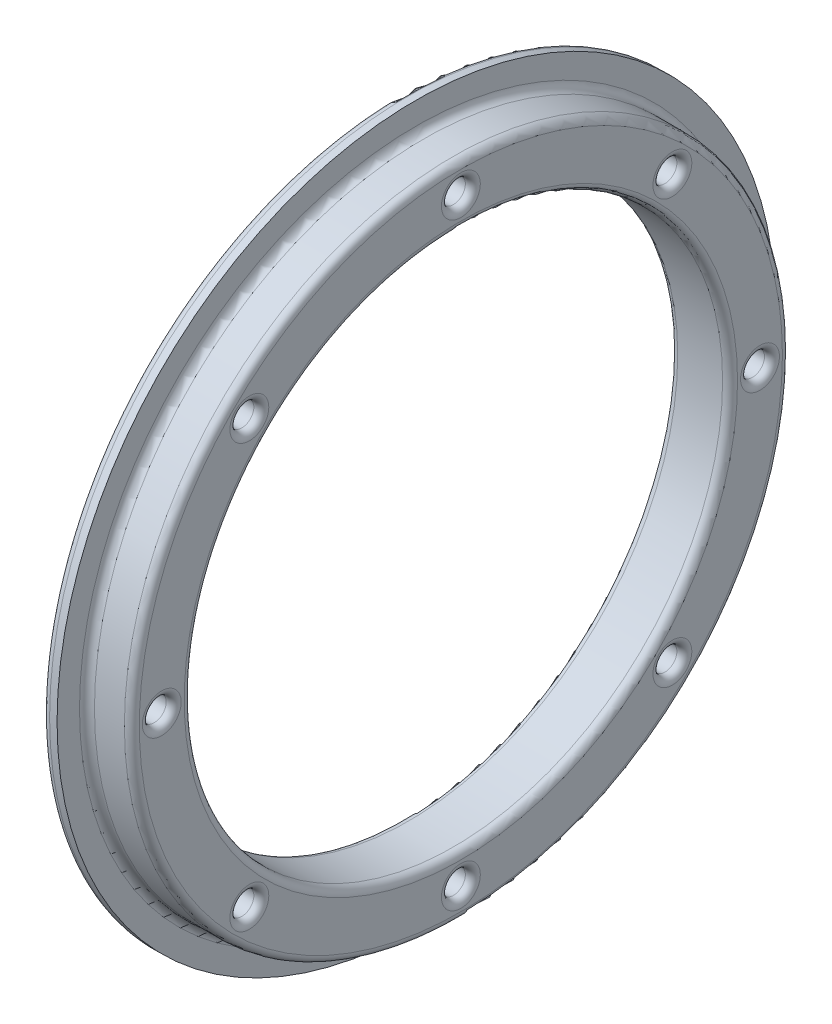
ISO-10303-21;
HEADER;
FILE_DESCRIPTION(('STEP AP214'),'2;1');
FILE_NAME('part.step','',(''),(''),'','','');
FILE_SCHEMA(('AUTOMOTIVE_DESIGN { 1 0 10303 214 1 1 1 1 }'));
ENDSEC;
DATA;
#1=APPLICATION_CONTEXT('core data for automotive mechanical design processes');
#2=APPLICATION_PROTOCOL_DEFINITION('international standard','automotive_design',2000,#1);
#3=PRODUCT_CONTEXT('',#1,'mechanical');
#4=PRODUCT('Part','Part','',(#3));
#5=PRODUCT_RELATED_PRODUCT_CATEGORY('part','',(#4));
#6=PRODUCT_DEFINITION_FORMATION('','',#4);
#7=PRODUCT_DEFINITION_CONTEXT('part definition',#1,'design');
#8=PRODUCT_DEFINITION('design','',#6,#7);
#9=PRODUCT_DEFINITION_SHAPE('','',#8);
#10=(LENGTH_UNIT() NAMED_UNIT(*) SI_UNIT(.MILLI.,.METRE.));
#11=(NAMED_UNIT(*) PLANE_ANGLE_UNIT() SI_UNIT($,.RADIAN.));
#12=(NAMED_UNIT(*) SI_UNIT($,.STERADIAN.) SOLID_ANGLE_UNIT());
#13=UNCERTAINTY_MEASURE_WITH_UNIT(LENGTH_MEASURE(1.E-05),#10,'distance_accuracy_value','');
#14=(GEOMETRIC_REPRESENTATION_CONTEXT(3) GLOBAL_UNCERTAINTY_ASSIGNED_CONTEXT((#13)) GLOBAL_UNIT_ASSIGNED_CONTEXT((#10,
#11,#12)) REPRESENTATION_CONTEXT('',''));
#15=CARTESIAN_POINT('',(0.,0.,0.));
#16=DIRECTION('',(0.,0.,1.));
#17=DIRECTION('',(1.,0.,0.));
#18=AXIS2_PLACEMENT_3D('',#15,#16,#17);
#19=CARTESIAN_POINT('',(3.175,0.,0.));
#20=DIRECTION('',(-1.,0.,0.));
#21=DIRECTION('',(0.,0.,1.));
#22=AXIS2_PLACEMENT_3D('',#19,#20,#21);
#23=CYLINDRICAL_SURFACE('',#22,34.925);
#24=CARTESIAN_POINT('',(2.38125,0.,0.));
#25=DIRECTION('',(1.,0.,0.));
#26=DIRECTION('',(0.,0.,-1.));
#27=AXIS2_PLACEMENT_3D('',#24,#25,#26);
#28=CIRCLE('',#27,34.925);
#29=CARTESIAN_POINT('',(2.38125,0.,-34.925));
#30=VERTEX_POINT('',#29);
#31=EDGE_CURVE('E38',#30,#30,#28,.F.);
#32=ORIENTED_EDGE('',*,*,#31,.T.);
#33=EDGE_LOOP('',(#32));
#34=FACE_BOUND('',#33,.T.);
#35=CARTESIAN_POINT('',(-0.79375,0.,0.));
#36=DIRECTION('',(-1.,0.,0.));
#37=DIRECTION('',(0.,0.,1.));
#38=AXIS2_PLACEMENT_3D('',#35,#36,#37);
#39=CIRCLE('',#38,34.925);
#40=CARTESIAN_POINT('',(-0.79375,0.,34.925));
#41=VERTEX_POINT('',#40);
#42=EDGE_CURVE('E42',#41,#41,#39,.F.);
#43=ORIENTED_EDGE('',*,*,#42,.T.);
#44=EDGE_LOOP('',(#43));
#45=FACE_BOUND('',#44,.T.);
#46=ADVANCED_FACE('F31',(#34,#45),#23,.T.);
#47=CARTESIAN_POINT('',(3.175,0.,0.));
#48=DIRECTION('',(1.,0.,0.));
#49=DIRECTION('',(0.,0.,-1.));
#50=AXIS2_PLACEMENT_3D('',#47,#48,#49);
#51=PLANE('',#50);
#52=CARTESIAN_POINT('',(3.175,-22.4506403026729,22.4506403026729));
#53=DIRECTION('',(1.,0.,0.));
#54=DIRECTION('',(0.,0.,-1.));
#55=AXIS2_PLACEMENT_3D('',#52,#53,#54);
#56=CIRCLE('',#55,2.06375);
#57=CARTESIAN_POINT('',(3.175,-22.4506403026729,20.3868903026729));
#58=VERTEX_POINT('',#57);
#59=EDGE_CURVE('E46',#58,#58,#56,.F.);
#60=ORIENTED_EDGE('',*,*,#59,.T.);
#61=EDGE_LOOP('',(#60));
#62=FACE_BOUND('',#61,.T.);
#63=CARTESIAN_POINT('',(3.175,-22.4506403026729,-22.4506403026729));
#64=DIRECTION('',(1.,0.,0.));
#65=DIRECTION('',(0.,0.,-1.));
#66=AXIS2_PLACEMENT_3D('',#63,#64,#65);
#67=CIRCLE('',#66,2.06375);
#68=CARTESIAN_POINT('',(3.175,-22.4506403026729,-24.5143903026729));
#69=VERTEX_POINT('',#68);
#70=EDGE_CURVE('E51',#69,#69,#67,.F.);
#71=ORIENTED_EDGE('',*,*,#70,.T.);
#72=EDGE_LOOP('',(#71));
#73=FACE_BOUND('',#72,.T.);
#74=CARTESIAN_POINT('',(3.175,22.4506403026729,-22.4506403026729));
#75=DIRECTION('',(1.,0.,0.));
#76=DIRECTION('',(0.,0.,-1.));
#77=AXIS2_PLACEMENT_3D('',#74,#75,#76);
#78=CIRCLE('',#77,2.06375);
#79=CARTESIAN_POINT('',(3.175,22.4506403026729,-24.5143903026729));
#80=VERTEX_POINT('',#79);
#81=EDGE_CURVE('E54',#80,#80,#78,.F.);
#82=ORIENTED_EDGE('',*,*,#81,.T.);
#83=EDGE_LOOP('',(#82));
#84=FACE_BOUND('',#83,.T.);
#85=CARTESIAN_POINT('',(3.175,22.4506403026729,22.4506403026729));
#86=DIRECTION('',(1.,0.,0.));
#87=DIRECTION('',(0.,0.,-1.));
#88=AXIS2_PLACEMENT_3D('',#85,#86,#87);
#89=CIRCLE('',#88,2.06375);
#90=CARTESIAN_POINT('',(3.175,22.4506403026729,20.3868903026729));
#91=VERTEX_POINT('',#90);
#92=EDGE_CURVE('E57',#91,#91,#89,.F.);
#93=ORIENTED_EDGE('',*,*,#92,.T.);
#94=EDGE_LOOP('',(#93));
#95=FACE_BOUND('',#94,.T.);
#96=CARTESIAN_POINT('',(3.175,0.,0.));
#97=DIRECTION('',(1.,0.,0.));
#98=DIRECTION('',(0.,0.,-1.));
#99=AXIS2_PLACEMENT_3D('',#96,#97,#98);
#100=CIRCLE('',#99,29.36875);
#101=CARTESIAN_POINT('',(3.175,0.,-29.36875));
#102=VERTEX_POINT('',#101);
#103=EDGE_CURVE('E60',#102,#102,#100,.F.);
#104=ORIENTED_EDGE('',*,*,#103,.T.);
#105=EDGE_LOOP('',(#104));
#106=FACE_BOUND('',#105,.T.);
#107=CARTESIAN_POINT('',(3.175,0.,0.));
#108=DIRECTION('',(1.,0.,0.));
#109=DIRECTION('',(0.,0.,-1.));
#110=AXIS2_PLACEMENT_3D('',#107,#108,#109);
#111=CIRCLE('',#110,34.13125);
#112=CARTESIAN_POINT('',(3.175,0.,-34.13125));
#113=VERTEX_POINT('',#112);
#114=EDGE_CURVE('E63',#113,#113,#111,.T.);
#115=ORIENTED_EDGE('',*,*,#114,.T.);
#116=EDGE_LOOP('',(#115));
#117=FACE_BOUND('',#116,.T.);
#118=CARTESIAN_POINT('',(3.175,0.,31.75));
#119=DIRECTION('',(1.,0.,0.));
#120=DIRECTION('',(0.,0.,-1.));
#121=AXIS2_PLACEMENT_3D('',#118,#119,#120);
#122=CIRCLE('',#121,2.06375);
#123=CARTESIAN_POINT('',(3.175,0.,29.68625));
#124=VERTEX_POINT('',#123);
#125=EDGE_CURVE('E66',#124,#124,#122,.F.);
#126=ORIENTED_EDGE('',*,*,#125,.T.);
#127=EDGE_LOOP('',(#126));
#128=FACE_BOUND('',#127,.T.);
#129=CARTESIAN_POINT('',(3.175,31.75,0.));
#130=DIRECTION('',(1.,0.,0.));
#131=DIRECTION('',(0.,0.,-1.));
#132=AXIS2_PLACEMENT_3D('',#129,#130,#131);
#133=CIRCLE('',#132,2.06375);
#134=CARTESIAN_POINT('',(3.175,31.75,-2.06375));
#135=VERTEX_POINT('',#134);
#136=EDGE_CURVE('E69',#135,#135,#133,.F.);
#137=ORIENTED_EDGE('',*,*,#136,.T.);
#138=EDGE_LOOP('',(#137));
#139=FACE_BOUND('',#138,.T.);
#140=CARTESIAN_POINT('',(3.175,0.,-31.75));
#141=DIRECTION('',(1.,0.,0.));
#142=DIRECTION('',(0.,0.,-1.));
#143=AXIS2_PLACEMENT_3D('',#140,#141,#142);
#144=CIRCLE('',#143,2.06375);
#145=CARTESIAN_POINT('',(3.175,0.,-33.81375));
#146=VERTEX_POINT('',#145);
#147=EDGE_CURVE('E72',#146,#146,#144,.F.);
#148=ORIENTED_EDGE('',*,*,#147,.T.);
#149=EDGE_LOOP('',(#148));
#150=FACE_BOUND('',#149,.T.);
#151=CARTESIAN_POINT('',(3.175,-31.75,0.));
#152=DIRECTION('',(1.,0.,0.));
#153=DIRECTION('',(0.,0.,-1.));
#154=AXIS2_PLACEMENT_3D('',#151,#152,#153);
#155=CIRCLE('',#154,2.06375);
#156=CARTESIAN_POINT('',(3.175,-31.75,-2.06375000000001));
#157=VERTEX_POINT('',#156);
#158=EDGE_CURVE('E75',#157,#157,#155,.F.);
#159=ORIENTED_EDGE('',*,*,#158,.T.);
#160=EDGE_LOOP('',(#159));
#161=FACE_BOUND('',#160,.T.);
#162=ADVANCED_FACE('F186',(#62,#73,#84,#95,#106,#117,#128,#139,#150,#161),#51,.T.);
#163=CARTESIAN_POINT('',(-3.175,0.,0.));
#164=DIRECTION('',(1.,0.,0.));
#165=DIRECTION('',(0.,0.,-1.));
#166=AXIS2_PLACEMENT_3D('',#163,#164,#165);
#167=PLANE('',#166);
#168=CARTESIAN_POINT('',(-3.175,0.,0.));
#169=DIRECTION('',(1.,0.,0.));
#170=DIRECTION('',(0.,0.,-1.));
#171=AXIS2_PLACEMENT_3D('',#168,#169,#170);
#172=CIRCLE('',#171,37.30625);
#173=CARTESIAN_POINT('',(-3.175,0.,-37.30625));
#174=VERTEX_POINT('',#173);
#175=EDGE_CURVE('E135',#174,#174,#172,.F.);
#176=ORIENTED_EDGE('',*,*,#175,.T.);
#177=EDGE_LOOP('',(#176));
#178=FACE_BOUND('',#177,.T.);
#179=CARTESIAN_POINT('',(-3.175,-22.4506403026729,22.4506403026729));
#180=DIRECTION('',(1.,0.,0.));
#181=DIRECTION('',(0.,0.,-1.));
#182=AXIS2_PLACEMENT_3D('',#179,#180,#181);
#183=CIRCLE('',#182,2.06375);
#184=CARTESIAN_POINT('',(-3.175,-22.4506403026729,20.3868903026729));
#185=VERTEX_POINT('',#184);
#186=EDGE_CURVE('E138',#185,#185,#183,.T.);
#187=ORIENTED_EDGE('',*,*,#186,.T.);
#188=EDGE_LOOP('',(#187));
#189=FACE_BOUND('',#188,.T.);
#190=CARTESIAN_POINT('',(-3.175,-31.75,0.));
#191=DIRECTION('',(1.,0.,0.));
#192=DIRECTION('',(0.,0.,-1.));
#193=AXIS2_PLACEMENT_3D('',#190,#191,#192);
#194=CIRCLE('',#193,2.06375);
#195=CARTESIAN_POINT('',(-3.175,-31.75,-2.06375000000001));
#196=VERTEX_POINT('',#195);
#197=EDGE_CURVE('E141',#196,#196,#194,.T.);
#198=ORIENTED_EDGE('',*,*,#197,.T.);
#199=EDGE_LOOP('',(#198));
#200=FACE_BOUND('',#199,.T.);
#201=CARTESIAN_POINT('',(-3.175,-22.4506403026729,-22.4506403026729));
#202=DIRECTION('',(1.,0.,0.));
#203=DIRECTION('',(0.,0.,-1.));
#204=AXIS2_PLACEMENT_3D('',#201,#202,#203);
#205=CIRCLE('',#204,2.06375);
#206=CARTESIAN_POINT('',(-3.175,-22.4506403026729,-24.5143903026729));
#207=VERTEX_POINT('',#206);
#208=EDGE_CURVE('E144',#207,#207,#205,.T.);
#209=ORIENTED_EDGE('',*,*,#208,.T.);
#210=EDGE_LOOP('',(#209));
#211=FACE_BOUND('',#210,.T.);
#212=CARTESIAN_POINT('',(-3.175,0.,-31.75));
#213=DIRECTION('',(1.,0.,0.));
#214=DIRECTION('',(0.,0.,-1.));
#215=AXIS2_PLACEMENT_3D('',#212,#213,#214);
#216=CIRCLE('',#215,2.06375);
#217=CARTESIAN_POINT('',(-3.175,0.,-33.81375));
#218=VERTEX_POINT('',#217);
#219=EDGE_CURVE('E147',#218,#218,#216,.T.);
#220=ORIENTED_EDGE('',*,*,#219,.T.);
#221=EDGE_LOOP('',(#220));
#222=FACE_BOUND('',#221,.T.);
#223=CARTESIAN_POINT('',(-3.175,22.4506403026729,-22.4506403026729));
#224=DIRECTION('',(1.,0.,0.));
#225=DIRECTION('',(0.,0.,-1.));
#226=AXIS2_PLACEMENT_3D('',#223,#224,#225);
#227=CIRCLE('',#226,2.06375);
#228=CARTESIAN_POINT('',(-3.175,22.4506403026729,-24.5143903026729));
#229=VERTEX_POINT('',#228);
#230=EDGE_CURVE('E150',#229,#229,#227,.T.);
#231=ORIENTED_EDGE('',*,*,#230,.T.);
#232=EDGE_LOOP('',(#231));
#233=FACE_BOUND('',#232,.T.);
#234=CARTESIAN_POINT('',(-3.175,31.75,0.));
#235=DIRECTION('',(1.,0.,0.));
#236=DIRECTION('',(0.,0.,-1.));
#237=AXIS2_PLACEMENT_3D('',#234,#235,#236);
#238=CIRCLE('',#237,2.06375);
#239=CARTESIAN_POINT('',(-3.175,31.75,-2.06375));
#240=VERTEX_POINT('',#239);
#241=EDGE_CURVE('E153',#240,#240,#238,.T.);
#242=ORIENTED_EDGE('',*,*,#241,.T.);
#243=EDGE_LOOP('',(#242));
#244=FACE_BOUND('',#243,.T.);
#245=CARTESIAN_POINT('',(-3.175,22.4506403026729,22.4506403026729));
#246=DIRECTION('',(1.,0.,0.));
#247=DIRECTION('',(0.,0.,-1.));
#248=AXIS2_PLACEMENT_3D('',#245,#246,#247);
#249=CIRCLE('',#248,2.06375);
#250=CARTESIAN_POINT('',(-3.175,22.4506403026729,20.3868903026729));
#251=VERTEX_POINT('',#250);
#252=EDGE_CURVE('E156',#251,#251,#249,.T.);
#253=ORIENTED_EDGE('',*,*,#252,.T.);
#254=EDGE_LOOP('',(#253));
#255=FACE_BOUND('',#254,.T.);
#256=CARTESIAN_POINT('',(-3.175,0.,31.75));
#257=DIRECTION('',(1.,0.,0.));
#258=DIRECTION('',(0.,0.,-1.));
#259=AXIS2_PLACEMENT_3D('',#256,#257,#258);
#260=CIRCLE('',#259,2.06375);
#261=CARTESIAN_POINT('',(-3.175,0.,29.68625));
#262=VERTEX_POINT('',#261);
#263=EDGE_CURVE('E159',#262,#262,#260,.T.);
#264=ORIENTED_EDGE('',*,*,#263,.T.);
#265=EDGE_LOOP('',(#264));
#266=FACE_BOUND('',#265,.T.);
#267=CARTESIAN_POINT('',(-3.175,0.,0.));
#268=DIRECTION('',(1.,0.,0.));
#269=DIRECTION('',(0.,0.,-1.));
#270=AXIS2_PLACEMENT_3D('',#267,#268,#269);
#271=CIRCLE('',#270,29.36875);
#272=CARTESIAN_POINT('',(-3.175,0.,-29.36875));
#273=VERTEX_POINT('',#272);
#274=EDGE_CURVE('E162',#273,#273,#271,.T.);
#275=ORIENTED_EDGE('',*,*,#274,.T.);
#276=EDGE_LOOP('',(#275));
#277=FACE_BOUND('',#276,.T.);
#278=ADVANCED_FACE('F191',(#178,#189,#200,#211,#222,#233,#244,#255,#266,#277),#167,.F.);
#279=CARTESIAN_POINT('',(3.175,0.,0.));
#280=DIRECTION('',(-1.,0.,0.));
#281=DIRECTION('',(0.,0.,1.));
#282=AXIS2_PLACEMENT_3D('',#279,#280,#281);
#283=CYLINDRICAL_SURFACE('',#282,28.575);
#284=CARTESIAN_POINT('',(-2.38125,0.,0.));
#285=DIRECTION('',(1.,0.,0.));
#286=DIRECTION('',(0.,0.,-1.));
#287=AXIS2_PLACEMENT_3D('',#284,#285,#286);
#288=CIRCLE('',#287,28.575);
#289=CARTESIAN_POINT('',(-2.38125,0.,-28.575));
#290=VERTEX_POINT('',#289);
#291=EDGE_CURVE('E78',#290,#290,#288,.F.);
#292=ORIENTED_EDGE('',*,*,#291,.T.);
#293=EDGE_LOOP('',(#292));
#294=FACE_BOUND('',#293,.T.);
#295=CARTESIAN_POINT('',(2.38125,0.,0.));
#296=DIRECTION('',(1.,0.,0.));
#297=DIRECTION('',(0.,0.,-1.));
#298=AXIS2_PLACEMENT_3D('',#295,#296,#297);
#299=CIRCLE('',#298,28.575);
#300=CARTESIAN_POINT('',(2.38125,0.,-28.575));
#301=VERTEX_POINT('',#300);
#302=EDGE_CURVE('E81',#301,#301,#299,.T.);
#303=ORIENTED_EDGE('',*,*,#302,.T.);
#304=EDGE_LOOP('',(#303));
#305=FACE_BOUND('',#304,.T.);
#306=ADVANCED_FACE('F311',(#294,#305),#283,.F.);
#307=CARTESIAN_POINT('',(3.175,0.,31.75));
#308=DIRECTION('',(-1.,0.,0.));
#309=DIRECTION('',(0.,0.,1.));
#310=AXIS2_PLACEMENT_3D('',#307,#308,#309);
#311=CYLINDRICAL_SURFACE('',#310,1.27);
#312=CARTESIAN_POINT('',(-2.38125,0.,31.75));
#313=DIRECTION('',(1.,0.,0.));
#314=DIRECTION('',(0.,0.,-1.));
#315=AXIS2_PLACEMENT_3D('',#312,#313,#314);
#316=CIRCLE('',#315,1.27);
#317=CARTESIAN_POINT('',(-2.38125,0.,30.48));
#318=VERTEX_POINT('',#317);
#319=EDGE_CURVE('E84',#318,#318,#316,.F.);
#320=ORIENTED_EDGE('',*,*,#319,.T.);
#321=EDGE_LOOP('',(#320));
#322=FACE_BOUND('',#321,.T.);
#323=CARTESIAN_POINT('',(2.38125,0.,31.75));
#324=DIRECTION('',(1.,0.,0.));
#325=DIRECTION('',(0.,0.,-1.));
#326=AXIS2_PLACEMENT_3D('',#323,#324,#325);
#327=CIRCLE('',#326,1.27);
#328=CARTESIAN_POINT('',(2.38125,0.,30.48));
#329=VERTEX_POINT('',#328);
#330=EDGE_CURVE('E87',#329,#329,#327,.T.);
#331=ORIENTED_EDGE('',*,*,#330,.T.);
#332=EDGE_LOOP('',(#331));
#333=FACE_BOUND('',#332,.T.);
#334=ADVANCED_FACE('F307',(#322,#333),#311,.F.);
#335=CARTESIAN_POINT('',(3.175,22.4506403026729,22.4506403026729));
#336=DIRECTION('',(-1.,0.,0.));
#337=DIRECTION('',(0.,0.,1.));
#338=AXIS2_PLACEMENT_3D('',#335,#336,#337);
#339=CYLINDRICAL_SURFACE('',#338,1.27);
#340=CARTESIAN_POINT('',(-2.38125,22.4506403026729,22.4506403026729));
#341=DIRECTION('',(1.,0.,0.));
#342=DIRECTION('',(0.,0.,-1.));
#343=AXIS2_PLACEMENT_3D('',#340,#341,#342);
#344=CIRCLE('',#343,1.27);
#345=CARTESIAN_POINT('',(-2.38125,22.4506403026729,21.1806403026729));
#346=VERTEX_POINT('',#345);
#347=EDGE_CURVE('E90',#346,#346,#344,.F.);
#348=ORIENTED_EDGE('',*,*,#347,.T.);
#349=EDGE_LOOP('',(#348));
#350=FACE_BOUND('',#349,.T.);
#351=CARTESIAN_POINT('',(2.38125,22.4506403026729,22.4506403026729));
#352=DIRECTION('',(1.,0.,0.));
#353=DIRECTION('',(0.,0.,-1.));
#354=AXIS2_PLACEMENT_3D('',#351,#352,#353);
#355=CIRCLE('',#354,1.27);
#356=CARTESIAN_POINT('',(2.38125,22.4506403026729,21.1806403026729));
#357=VERTEX_POINT('',#356);
#358=EDGE_CURVE('E93',#357,#357,#355,.T.);
#359=ORIENTED_EDGE('',*,*,#358,.T.);
#360=EDGE_LOOP('',(#359));
#361=FACE_BOUND('',#360,.T.);
#362=ADVANCED_FACE('F303',(#350,#361),#339,.F.);
#363=CARTESIAN_POINT('',(3.175,31.75,0.));
#364=DIRECTION('',(-1.,0.,0.));
#365=DIRECTION('',(0.,0.,1.));
#366=AXIS2_PLACEMENT_3D('',#363,#364,#365);
#367=CYLINDRICAL_SURFACE('',#366,1.27);
#368=CARTESIAN_POINT('',(-2.38125,31.75,0.));
#369=DIRECTION('',(1.,0.,0.));
#370=DIRECTION('',(0.,0.,-1.));
#371=AXIS2_PLACEMENT_3D('',#368,#369,#370);
#372=CIRCLE('',#371,1.27);
#373=CARTESIAN_POINT('',(-2.38125,31.75,-1.27));
#374=VERTEX_POINT('',#373);
#375=EDGE_CURVE('E96',#374,#374,#372,.F.);
#376=ORIENTED_EDGE('',*,*,#375,.T.);
#377=EDGE_LOOP('',(#376));
#378=FACE_BOUND('',#377,.T.);
#379=CARTESIAN_POINT('',(2.38125,31.75,0.));
#380=DIRECTION('',(1.,0.,0.));
#381=DIRECTION('',(0.,0.,-1.));
#382=AXIS2_PLACEMENT_3D('',#379,#380,#381);
#383=CIRCLE('',#382,1.27);
#384=CARTESIAN_POINT('',(2.38125,31.75,-1.27));
#385=VERTEX_POINT('',#384);
#386=EDGE_CURVE('E99',#385,#385,#383,.T.);
#387=ORIENTED_EDGE('',*,*,#386,.T.);
#388=EDGE_LOOP('',(#387));
#389=FACE_BOUND('',#388,.T.);
#390=ADVANCED_FACE('F299',(#378,#389),#367,.F.);
#391=CARTESIAN_POINT('',(3.175,22.4506403026729,-22.4506403026729));
#392=DIRECTION('',(-1.,0.,0.));
#393=DIRECTION('',(0.,0.,1.));
#394=AXIS2_PLACEMENT_3D('',#391,#392,#393);
#395=CYLINDRICAL_SURFACE('',#394,1.27);
#396=CARTESIAN_POINT('',(-2.38125,22.4506403026729,-22.4506403026729));
#397=DIRECTION('',(1.,0.,0.));
#398=DIRECTION('',(0.,0.,-1.));
#399=AXIS2_PLACEMENT_3D('',#396,#397,#398);
#400=CIRCLE('',#399,1.27);
#401=CARTESIAN_POINT('',(-2.38125,22.4506403026729,-23.7206403026729));
#402=VERTEX_POINT('',#401);
#403=EDGE_CURVE('E102',#402,#402,#400,.F.);
#404=ORIENTED_EDGE('',*,*,#403,.T.);
#405=EDGE_LOOP('',(#404));
#406=FACE_BOUND('',#405,.T.);
#407=CARTESIAN_POINT('',(2.38125,22.4506403026729,-22.4506403026729));
#408=DIRECTION('',(1.,0.,0.));
#409=DIRECTION('',(0.,0.,-1.));
#410=AXIS2_PLACEMENT_3D('',#407,#408,#409);
#411=CIRCLE('',#410,1.27);
#412=CARTESIAN_POINT('',(2.38125,22.4506403026729,-23.7206403026729));
#413=VERTEX_POINT('',#412);
#414=EDGE_CURVE('E105',#413,#413,#411,.T.);
#415=ORIENTED_EDGE('',*,*,#414,.T.);
#416=EDGE_LOOP('',(#415));
#417=FACE_BOUND('',#416,.T.);
#418=ADVANCED_FACE('F295',(#406,#417),#395,.F.);
#419=CARTESIAN_POINT('',(3.175,0.,-31.75));
#420=DIRECTION('',(-1.,0.,0.));
#421=DIRECTION('',(0.,0.,1.));
#422=AXIS2_PLACEMENT_3D('',#419,#420,#421);
#423=CYLINDRICAL_SURFACE('',#422,1.27);
#424=CARTESIAN_POINT('',(-2.38125,0.,-31.75));
#425=DIRECTION('',(1.,0.,0.));
#426=DIRECTION('',(0.,0.,-1.));
#427=AXIS2_PLACEMENT_3D('',#424,#425,#426);
#428=CIRCLE('',#427,1.27);
#429=CARTESIAN_POINT('',(-2.38125,0.,-33.02));
#430=VERTEX_POINT('',#429);
#431=EDGE_CURVE('E108',#430,#430,#428,.F.);
#432=ORIENTED_EDGE('',*,*,#431,.T.);
#433=EDGE_LOOP('',(#432));
#434=FACE_BOUND('',#433,.T.);
#435=CARTESIAN_POINT('',(2.38125,0.,-31.75));
#436=DIRECTION('',(1.,0.,0.));
#437=DIRECTION('',(0.,0.,-1.));
#438=AXIS2_PLACEMENT_3D('',#435,#436,#437);
#439=CIRCLE('',#438,1.27);
#440=CARTESIAN_POINT('',(2.38125,0.,-33.02));
#441=VERTEX_POINT('',#440);
#442=EDGE_CURVE('E111',#441,#441,#439,.T.);
#443=ORIENTED_EDGE('',*,*,#442,.T.);
#444=EDGE_LOOP('',(#443));
#445=FACE_BOUND('',#444,.T.);
#446=ADVANCED_FACE('F289',(#434,#445),#423,.F.);
#447=CARTESIAN_POINT('',(3.175,-22.4506403026729,-22.4506403026729));
#448=DIRECTION('',(-1.,0.,0.));
#449=DIRECTION('',(0.,0.,1.));
#450=AXIS2_PLACEMENT_3D('',#447,#448,#449);
#451=CYLINDRICAL_SURFACE('',#450,1.27);
#452=CARTESIAN_POINT('',(-2.38125,-22.4506403026729,-22.4506403026729));
#453=DIRECTION('',(1.,0.,0.));
#454=DIRECTION('',(0.,0.,-1.));
#455=AXIS2_PLACEMENT_3D('',#452,#453,#454);
#456=CIRCLE('',#455,1.27);
#457=CARTESIAN_POINT('',(-2.38125,-22.4506403026729,-23.7206403026729));
#458=VERTEX_POINT('',#457);
#459=EDGE_CURVE('E114',#458,#458,#456,.F.);
#460=ORIENTED_EDGE('',*,*,#459,.T.);
#461=EDGE_LOOP('',(#460));
#462=FACE_BOUND('',#461,.T.);
#463=CARTESIAN_POINT('',(2.38125,-22.4506403026729,-22.4506403026729));
#464=DIRECTION('',(1.,0.,0.));
#465=DIRECTION('',(0.,0.,-1.));
#466=AXIS2_PLACEMENT_3D('',#463,#464,#465);
#467=CIRCLE('',#466,1.27);
#468=CARTESIAN_POINT('',(2.38125,-22.4506403026729,-23.7206403026729));
#469=VERTEX_POINT('',#468);
#470=EDGE_CURVE('E117',#469,#469,#467,.T.);
#471=ORIENTED_EDGE('',*,*,#470,.T.);
#472=EDGE_LOOP('',(#471));
#473=FACE_BOUND('',#472,.T.);
#474=ADVANCED_FACE('F280',(#462,#473),#451,.F.);
#475=CARTESIAN_POINT('',(3.175,-31.75,0.));
#476=DIRECTION('',(-1.,0.,0.));
#477=DIRECTION('',(0.,0.,1.));
#478=AXIS2_PLACEMENT_3D('',#475,#476,#477);
#479=CYLINDRICAL_SURFACE('',#478,1.27);
#480=CARTESIAN_POINT('',(-2.38125,-31.75,0.));
#481=DIRECTION('',(1.,0.,0.));
#482=DIRECTION('',(0.,0.,-1.));
#483=AXIS2_PLACEMENT_3D('',#480,#481,#482);
#484=CIRCLE('',#483,1.27);
#485=CARTESIAN_POINT('',(-2.38125,-31.75,-1.27000000000001));
#486=VERTEX_POINT('',#485);
#487=EDGE_CURVE('E120',#486,#486,#484,.F.);
#488=ORIENTED_EDGE('',*,*,#487,.T.);
#489=EDGE_LOOP('',(#488));
#490=FACE_BOUND('',#489,.T.);
#491=CARTESIAN_POINT('',(2.38125,-31.75,0.));
#492=DIRECTION('',(1.,0.,0.));
#493=DIRECTION('',(0.,0.,-1.));
#494=AXIS2_PLACEMENT_3D('',#491,#492,#493);
#495=CIRCLE('',#494,1.27);
#496=CARTESIAN_POINT('',(2.38125,-31.75,-1.27000000000001));
#497=VERTEX_POINT('',#496);
#498=EDGE_CURVE('E123',#497,#497,#495,.T.);
#499=ORIENTED_EDGE('',*,*,#498,.T.);
#500=EDGE_LOOP('',(#499));
#501=FACE_BOUND('',#500,.T.);
#502=ADVANCED_FACE('F278',(#490,#501),#479,.F.);
#503=CARTESIAN_POINT('',(3.175,-22.4506403026729,22.4506403026729));
#504=DIRECTION('',(-1.,0.,0.));
#505=DIRECTION('',(0.,0.,1.));
#506=AXIS2_PLACEMENT_3D('',#503,#504,#505);
#507=CYLINDRICAL_SURFACE('',#506,1.27);
#508=CARTESIAN_POINT('',(-2.38125,-22.4506403026729,22.4506403026729));
#509=DIRECTION('',(1.,0.,0.));
#510=DIRECTION('',(0.,0.,-1.));
#511=AXIS2_PLACEMENT_3D('',#508,#509,#510);
#512=CIRCLE('',#511,1.27);
#513=CARTESIAN_POINT('',(-2.38125,-22.4506403026729,21.1806403026729));
#514=VERTEX_POINT('',#513);
#515=EDGE_CURVE('E126',#514,#514,#512,.F.);
#516=ORIENTED_EDGE('',*,*,#515,.T.);
#517=EDGE_LOOP('',(#516));
#518=FACE_BOUND('',#517,.T.);
#519=CARTESIAN_POINT('',(2.38125,-22.4506403026729,22.4506403026729));
#520=DIRECTION('',(1.,0.,0.));
#521=DIRECTION('',(0.,0.,-1.));
#522=AXIS2_PLACEMENT_3D('',#519,#520,#521);
#523=CIRCLE('',#522,1.27);
#524=CARTESIAN_POINT('',(2.38125,-22.4506403026729,21.1806403026729));
#525=VERTEX_POINT('',#524);
#526=EDGE_CURVE('E129',#525,#525,#523,.T.);
#527=ORIENTED_EDGE('',*,*,#526,.T.);
#528=EDGE_LOOP('',(#527));
#529=FACE_BOUND('',#528,.T.);
#530=ADVANCED_FACE('F182',(#518,#529),#507,.F.);
#531=CARTESIAN_POINT('',(-1.5875,0.,0.));
#532=DIRECTION('',(-1.,0.,0.));
#533=DIRECTION('',(0.,0.,1.));
#534=AXIS2_PLACEMENT_3D('',#531,#532,#533);
#535=CYLINDRICAL_SURFACE('',#534,38.1);
#536=CARTESIAN_POINT('',(-2.38125,0.,0.));
#537=DIRECTION('',(1.,0.,0.));
#538=DIRECTION('',(0.,0.,-1.));
#539=AXIS2_PLACEMENT_3D('',#536,#537,#538);
#540=CIRCLE('',#539,38.1);
#541=CARTESIAN_POINT('',(-2.38125,0.,-38.1));
#542=VERTEX_POINT('',#541);
#543=EDGE_CURVE('E132',#542,#542,#540,.T.);
#544=ORIENTED_EDGE('',*,*,#543,.T.);
#545=EDGE_LOOP('',(#544));
#546=FACE_BOUND('',#545,.T.);
#547=CARTESIAN_POINT('',(-1.5875,0.,0.));
#548=DIRECTION('',(-1.,0.,0.));
#549=DIRECTION('',(0.,0.,1.));
#550=AXIS2_PLACEMENT_3D('',#547,#548,#549);
#551=CIRCLE('',#550,38.1);
#552=CARTESIAN_POINT('',(-1.5875,0.,38.1));
#553=VERTEX_POINT('',#552);
#554=EDGE_CURVE('E165',#553,#553,#551,.T.);
#555=ORIENTED_EDGE('',*,*,#554,.T.);
#556=EDGE_LOOP('',(#555));
#557=FACE_BOUND('',#556,.T.);
#558=ADVANCED_FACE('F169',(#546,#557),#535,.T.);
#559=CARTESIAN_POINT('',(-1.5875,0.,0.));
#560=DIRECTION('',(-1.,0.,0.));
#561=DIRECTION('',(0.,0.,1.));
#562=AXIS2_PLACEMENT_3D('',#559,#560,#561);
#563=PLANE('',#562);
#564=CARTESIAN_POINT('',(-1.5875,0.,0.));
#565=DIRECTION('',(-1.,0.,0.));
#566=DIRECTION('',(0.,0.,1.));
#567=AXIS2_PLACEMENT_3D('',#564,#565,#566);
#568=CIRCLE('',#567,35.71875);
#569=CARTESIAN_POINT('',(-1.5875,0.,35.71875));
#570=VERTEX_POINT('',#569);
#571=EDGE_CURVE('E10',#570,#570,#568,.T.);
#572=ORIENTED_EDGE('',*,*,#571,.T.);
#573=EDGE_LOOP('',(#572));
#574=FACE_BOUND('',#573,.T.);
#575=ORIENTED_EDGE('',*,*,#554,.F.);
#576=EDGE_LOOP('',(#575));
#577=FACE_BOUND('',#576,.T.);
#578=ADVANCED_FACE('F171',(#574,#577),#563,.F.);
#579=CARTESIAN_POINT('',(-2.38125,0.,0.));
#580=DIRECTION('',(1.,0.,0.));
#581=DIRECTION('',(0.,0.,-1.));
#582=AXIS2_PLACEMENT_3D('',#579,#580,#581);
#583=TOROIDAL_SURFACE('',#582,37.30625,0.79375);
#584=ORIENTED_EDGE('',*,*,#543,.F.);
#585=EDGE_LOOP('',(#584));
#586=FACE_BOUND('',#585,.T.);
#587=ORIENTED_EDGE('',*,*,#175,.F.);
#588=EDGE_LOOP('',(#587));
#589=FACE_BOUND('',#588,.T.);
#590=ADVANCED_FACE('F173',(#586,#589),#583,.T.);
#591=CARTESIAN_POINT('',(-2.38125,-22.4506403026729,22.4506403026729));
#592=DIRECTION('',(1.,0.,0.));
#593=DIRECTION('',(0.,0.,-1.));
#594=AXIS2_PLACEMENT_3D('',#591,#592,#593);
#595=TOROIDAL_SURFACE('',#594,2.06375,0.79375);
#596=ORIENTED_EDGE('',*,*,#515,.F.);
#597=EDGE_LOOP('',(#596));
#598=FACE_BOUND('',#597,.T.);
#599=ORIENTED_EDGE('',*,*,#186,.F.);
#600=EDGE_LOOP('',(#599));
#601=FACE_BOUND('',#600,.T.);
#602=ADVANCED_FACE('F179',(#598,#601),#595,.T.);
#603=CARTESIAN_POINT('',(-2.38125,-31.75,0.));
#604=DIRECTION('',(1.,0.,0.));
#605=DIRECTION('',(0.,0.,-1.));
#606=AXIS2_PLACEMENT_3D('',#603,#604,#605);
#607=TOROIDAL_SURFACE('',#606,2.06375,0.79375);
#608=ORIENTED_EDGE('',*,*,#487,.F.);
#609=EDGE_LOOP('',(#608));
#610=FACE_BOUND('',#609,.T.);
#611=ORIENTED_EDGE('',*,*,#197,.F.);
#612=EDGE_LOOP('',(#611));
#613=FACE_BOUND('',#612,.T.);
#614=ADVANCED_FACE('F199',(#610,#613),#607,.T.);
#615=CARTESIAN_POINT('',(-2.38125,-22.4506403026729,-22.4506403026729));
#616=DIRECTION('',(1.,0.,0.));
#617=DIRECTION('',(0.,0.,-1.));
#618=AXIS2_PLACEMENT_3D('',#615,#616,#617);
#619=TOROIDAL_SURFACE('',#618,2.06375,0.79375);
#620=ORIENTED_EDGE('',*,*,#459,.F.);
#621=EDGE_LOOP('',(#620));
#622=FACE_BOUND('',#621,.T.);
#623=ORIENTED_EDGE('',*,*,#208,.F.);
#624=EDGE_LOOP('',(#623));
#625=FACE_BOUND('',#624,.T.);
#626=ADVANCED_FACE('F203',(#622,#625),#619,.T.);
#627=CARTESIAN_POINT('',(-2.38125,0.,-31.75));
#628=DIRECTION('',(1.,0.,0.));
#629=DIRECTION('',(0.,0.,-1.));
#630=AXIS2_PLACEMENT_3D('',#627,#628,#629);
#631=TOROIDAL_SURFACE('',#630,2.06375,0.79375);
#632=ORIENTED_EDGE('',*,*,#431,.F.);
#633=EDGE_LOOP('',(#632));
#634=FACE_BOUND('',#633,.T.);
#635=ORIENTED_EDGE('',*,*,#219,.F.);
#636=EDGE_LOOP('',(#635));
#637=FACE_BOUND('',#636,.T.);
#638=ADVANCED_FACE('F207',(#634,#637),#631,.T.);
#639=CARTESIAN_POINT('',(-2.38125,22.4506403026729,-22.4506403026729));
#640=DIRECTION('',(1.,0.,0.));
#641=DIRECTION('',(0.,0.,-1.));
#642=AXIS2_PLACEMENT_3D('',#639,#640,#641);
#643=TOROIDAL_SURFACE('',#642,2.06375,0.79375);
#644=ORIENTED_EDGE('',*,*,#403,.F.);
#645=EDGE_LOOP('',(#644));
#646=FACE_BOUND('',#645,.T.);
#647=ORIENTED_EDGE('',*,*,#230,.F.);
#648=EDGE_LOOP('',(#647));
#649=FACE_BOUND('',#648,.T.);
#650=ADVANCED_FACE('F211',(#646,#649),#643,.T.);
#651=CARTESIAN_POINT('',(-2.38125,31.75,0.));
#652=DIRECTION('',(1.,0.,0.));
#653=DIRECTION('',(0.,0.,-1.));
#654=AXIS2_PLACEMENT_3D('',#651,#652,#653);
#655=TOROIDAL_SURFACE('',#654,2.06375,0.79375);
#656=ORIENTED_EDGE('',*,*,#375,.F.);
#657=EDGE_LOOP('',(#656));
#658=FACE_BOUND('',#657,.T.);
#659=ORIENTED_EDGE('',*,*,#241,.F.);
#660=EDGE_LOOP('',(#659));
#661=FACE_BOUND('',#660,.T.);
#662=ADVANCED_FACE('F215',(#658,#661),#655,.T.);
#663=CARTESIAN_POINT('',(-2.38125,22.4506403026729,22.4506403026729));
#664=DIRECTION('',(1.,0.,0.));
#665=DIRECTION('',(0.,0.,-1.));
#666=AXIS2_PLACEMENT_3D('',#663,#664,#665);
#667=TOROIDAL_SURFACE('',#666,2.06375,0.79375);
#668=ORIENTED_EDGE('',*,*,#347,.F.);
#669=EDGE_LOOP('',(#668));
#670=FACE_BOUND('',#669,.T.);
#671=ORIENTED_EDGE('',*,*,#252,.F.);
#672=EDGE_LOOP('',(#671));
#673=FACE_BOUND('',#672,.T.);
#674=ADVANCED_FACE('F219',(#670,#673),#667,.T.);
#675=CARTESIAN_POINT('',(-2.38125,0.,31.75));
#676=DIRECTION('',(1.,0.,0.));
#677=DIRECTION('',(0.,0.,-1.));
#678=AXIS2_PLACEMENT_3D('',#675,#676,#677);
#679=TOROIDAL_SURFACE('',#678,2.06375,0.79375);
#680=ORIENTED_EDGE('',*,*,#319,.F.);
#681=EDGE_LOOP('',(#680));
#682=FACE_BOUND('',#681,.T.);
#683=ORIENTED_EDGE('',*,*,#263,.F.);
#684=EDGE_LOOP('',(#683));
#685=FACE_BOUND('',#684,.T.);
#686=ADVANCED_FACE('F223',(#682,#685),#679,.T.);
#687=CARTESIAN_POINT('',(-2.38125,0.,0.));
#688=DIRECTION('',(1.,0.,0.));
#689=DIRECTION('',(0.,0.,-1.));
#690=AXIS2_PLACEMENT_3D('',#687,#688,#689);
#691=TOROIDAL_SURFACE('',#690,29.36875,0.79375);
#692=ORIENTED_EDGE('',*,*,#291,.F.);
#693=EDGE_LOOP('',(#692));
#694=FACE_BOUND('',#693,.T.);
#695=ORIENTED_EDGE('',*,*,#274,.F.);
#696=EDGE_LOOP('',(#695));
#697=FACE_BOUND('',#696,.T.);
#698=ADVANCED_FACE('F227',(#694,#697),#691,.T.);
#699=CARTESIAN_POINT('',(2.38125,-22.4506403026729,22.4506403026729));
#700=DIRECTION('',(1.,0.,0.));
#701=DIRECTION('',(0.,0.,-1.));
#702=AXIS2_PLACEMENT_3D('',#699,#700,#701);
#703=TOROIDAL_SURFACE('',#702,2.06375,0.79375);
#704=ORIENTED_EDGE('',*,*,#59,.F.);
#705=EDGE_LOOP('',(#704));
#706=FACE_BOUND('',#705,.T.);
#707=ORIENTED_EDGE('',*,*,#526,.F.);
#708=EDGE_LOOP('',(#707));
#709=FACE_BOUND('',#708,.T.);
#710=ADVANCED_FACE('F231',(#706,#709),#703,.T.);
#711=CARTESIAN_POINT('',(2.38125,-22.4506403026729,-22.4506403026729));
#712=DIRECTION('',(1.,0.,0.));
#713=DIRECTION('',(0.,0.,-1.));
#714=AXIS2_PLACEMENT_3D('',#711,#712,#713);
#715=TOROIDAL_SURFACE('',#714,2.06375,0.79375);
#716=ORIENTED_EDGE('',*,*,#70,.F.);
#717=EDGE_LOOP('',(#716));
#718=FACE_BOUND('',#717,.T.);
#719=ORIENTED_EDGE('',*,*,#470,.F.);
#720=EDGE_LOOP('',(#719));
#721=FACE_BOUND('',#720,.T.);
#722=ADVANCED_FACE('F235',(#718,#721),#715,.T.);
#723=CARTESIAN_POINT('',(2.38125,22.4506403026729,-22.4506403026729));
#724=DIRECTION('',(1.,0.,0.));
#725=DIRECTION('',(0.,0.,-1.));
#726=AXIS2_PLACEMENT_3D('',#723,#724,#725);
#727=TOROIDAL_SURFACE('',#726,2.06375,0.79375);
#728=ORIENTED_EDGE('',*,*,#81,.F.);
#729=EDGE_LOOP('',(#728));
#730=FACE_BOUND('',#729,.T.);
#731=ORIENTED_EDGE('',*,*,#414,.F.);
#732=EDGE_LOOP('',(#731));
#733=FACE_BOUND('',#732,.T.);
#734=ADVANCED_FACE('F239',(#730,#733),#727,.T.);
#735=CARTESIAN_POINT('',(2.38125,22.4506403026729,22.4506403026729));
#736=DIRECTION('',(1.,0.,0.));
#737=DIRECTION('',(0.,0.,-1.));
#738=AXIS2_PLACEMENT_3D('',#735,#736,#737);
#739=TOROIDAL_SURFACE('',#738,2.06375,0.79375);
#740=ORIENTED_EDGE('',*,*,#92,.F.);
#741=EDGE_LOOP('',(#740));
#742=FACE_BOUND('',#741,.T.);
#743=ORIENTED_EDGE('',*,*,#358,.F.);
#744=EDGE_LOOP('',(#743));
#745=FACE_BOUND('',#744,.T.);
#746=ADVANCED_FACE('F243',(#742,#745),#739,.T.);
#747=CARTESIAN_POINT('',(2.38125,0.,0.));
#748=DIRECTION('',(1.,0.,0.));
#749=DIRECTION('',(0.,0.,-1.));
#750=AXIS2_PLACEMENT_3D('',#747,#748,#749);
#751=TOROIDAL_SURFACE('',#750,29.36875,0.79375);
#752=ORIENTED_EDGE('',*,*,#103,.F.);
#753=EDGE_LOOP('',(#752));
#754=FACE_BOUND('',#753,.T.);
#755=ORIENTED_EDGE('',*,*,#302,.F.);
#756=EDGE_LOOP('',(#755));
#757=FACE_BOUND('',#756,.T.);
#758=ADVANCED_FACE('F247',(#754,#757),#751,.T.);
#759=CARTESIAN_POINT('',(2.38125,0.,0.));
#760=DIRECTION('',(1.,0.,0.));
#761=DIRECTION('',(0.,0.,-1.));
#762=AXIS2_PLACEMENT_3D('',#759,#760,#761);
#763=TOROIDAL_SURFACE('',#762,34.13125,0.79375);
#764=ORIENTED_EDGE('',*,*,#31,.F.);
#765=EDGE_LOOP('',(#764));
#766=FACE_BOUND('',#765,.T.);
#767=ORIENTED_EDGE('',*,*,#114,.F.);
#768=EDGE_LOOP('',(#767));
#769=FACE_BOUND('',#768,.T.);
#770=ADVANCED_FACE('F251',(#766,#769),#763,.T.);
#771=CARTESIAN_POINT('',(2.38125,0.,31.75));
#772=DIRECTION('',(1.,0.,0.));
#773=DIRECTION('',(0.,0.,-1.));
#774=AXIS2_PLACEMENT_3D('',#771,#772,#773);
#775=TOROIDAL_SURFACE('',#774,2.06375,0.79375);
#776=ORIENTED_EDGE('',*,*,#125,.F.);
#777=EDGE_LOOP('',(#776));
#778=FACE_BOUND('',#777,.T.);
#779=ORIENTED_EDGE('',*,*,#330,.F.);
#780=EDGE_LOOP('',(#779));
#781=FACE_BOUND('',#780,.T.);
#782=ADVANCED_FACE('F255',(#778,#781),#775,.T.);
#783=CARTESIAN_POINT('',(2.38125,31.75,0.));
#784=DIRECTION('',(1.,0.,0.));
#785=DIRECTION('',(0.,0.,-1.));
#786=AXIS2_PLACEMENT_3D('',#783,#784,#785);
#787=TOROIDAL_SURFACE('',#786,2.06375,0.79375);
#788=ORIENTED_EDGE('',*,*,#136,.F.);
#789=EDGE_LOOP('',(#788));
#790=FACE_BOUND('',#789,.T.);
#791=ORIENTED_EDGE('',*,*,#386,.F.);
#792=EDGE_LOOP('',(#791));
#793=FACE_BOUND('',#792,.T.);
#794=ADVANCED_FACE('F259',(#790,#793),#787,.T.);
#795=CARTESIAN_POINT('',(2.38125,0.,-31.75));
#796=DIRECTION('',(1.,0.,0.));
#797=DIRECTION('',(0.,0.,-1.));
#798=AXIS2_PLACEMENT_3D('',#795,#796,#797);
#799=TOROIDAL_SURFACE('',#798,2.06375,0.79375);
#800=ORIENTED_EDGE('',*,*,#147,.F.);
#801=EDGE_LOOP('',(#800));
#802=FACE_BOUND('',#801,.T.);
#803=ORIENTED_EDGE('',*,*,#442,.F.);
#804=EDGE_LOOP('',(#803));
#805=FACE_BOUND('',#804,.T.);
#806=ADVANCED_FACE('F263',(#802,#805),#799,.T.);
#807=CARTESIAN_POINT('',(2.38125,-31.75,0.));
#808=DIRECTION('',(1.,0.,0.));
#809=DIRECTION('',(0.,0.,-1.));
#810=AXIS2_PLACEMENT_3D('',#807,#808,#809);
#811=TOROIDAL_SURFACE('',#810,2.06375,0.79375);
#812=ORIENTED_EDGE('',*,*,#158,.F.);
#813=EDGE_LOOP('',(#812));
#814=FACE_BOUND('',#813,.T.);
#815=ORIENTED_EDGE('',*,*,#498,.F.);
#816=EDGE_LOOP('',(#815));
#817=FACE_BOUND('',#816,.T.);
#818=ADVANCED_FACE('F266',(#814,#817),#811,.T.);
#819=CARTESIAN_POINT('',(-0.79375,0.,0.));
#820=DIRECTION('',(-1.,0.,0.));
#821=DIRECTION('',(0.,0.,1.));
#822=AXIS2_PLACEMENT_3D('',#819,#820,#821);
#823=TOROIDAL_SURFACE('',#822,35.71875,0.79375);
#824=ORIENTED_EDGE('',*,*,#42,.F.);
#825=EDGE_LOOP('',(#824));
#826=FACE_BOUND('',#825,.T.);
#827=ORIENTED_EDGE('',*,*,#571,.F.);
#828=EDGE_LOOP('',(#827));
#829=FACE_BOUND('',#828,.T.);
#830=ADVANCED_FACE('F33',(#826,#829),#823,.F.);
#831=CLOSED_SHELL('',(#46,#162,#278,#306,#334,#362,#390,#418,#446,#474,#502,#530,#558,#578,#590,
#602,#614,#626,#638,#650,#662,#674,#686,#698,#710,#722,#734,#746,#758,#770,#782,#794,#806,#818,#830));
#832=MANIFOLD_SOLID_BREP('B2',#831);
#833=ADVANCED_BREP_SHAPE_REPRESENTATION('',(#18,#832),#14);
#834=SHAPE_DEFINITION_REPRESENTATION(#9,#833);
ENDSEC;
END-ISO-10303-21;
